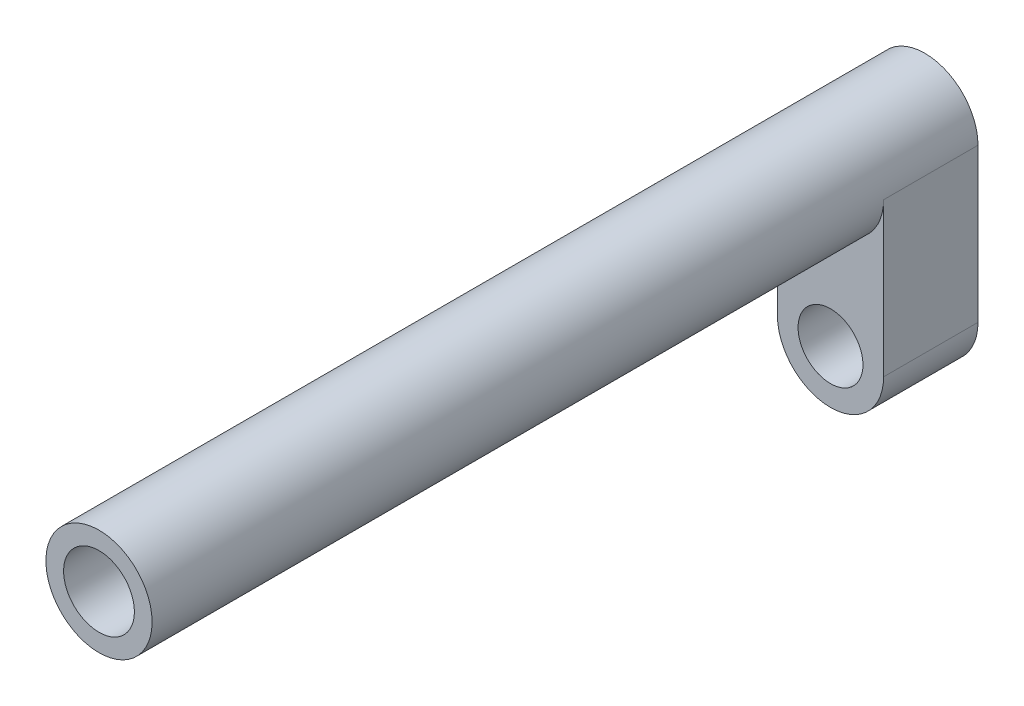
ISO-10303-21;
HEADER;
FILE_DESCRIPTION(('STEP AP214'),'2;1');
FILE_NAME('part.step','',(''),(''),'','','');
FILE_SCHEMA(('AUTOMOTIVE_DESIGN { 1 0 10303 214 1 1 1 1 }'));
ENDSEC;
DATA;
#1=APPLICATION_CONTEXT('core data for automotive mechanical design processes');
#2=APPLICATION_PROTOCOL_DEFINITION('international standard','automotive_design',2000,#1);
#3=PRODUCT_CONTEXT('',#1,'mechanical');
#4=PRODUCT('Part','Part','',(#3));
#5=PRODUCT_RELATED_PRODUCT_CATEGORY('part','',(#4));
#6=PRODUCT_DEFINITION_FORMATION('','',#4);
#7=PRODUCT_DEFINITION_CONTEXT('part definition',#1,'design');
#8=PRODUCT_DEFINITION('design','',#6,#7);
#9=PRODUCT_DEFINITION_SHAPE('','',#8);
#10=(LENGTH_UNIT() NAMED_UNIT(*) SI_UNIT(.MILLI.,.METRE.));
#11=(NAMED_UNIT(*) PLANE_ANGLE_UNIT() SI_UNIT($,.RADIAN.));
#12=(NAMED_UNIT(*) SI_UNIT($,.STERADIAN.) SOLID_ANGLE_UNIT());
#13=UNCERTAINTY_MEASURE_WITH_UNIT(LENGTH_MEASURE(1.E-05),#10,'distance_accuracy_value','');
#14=(GEOMETRIC_REPRESENTATION_CONTEXT(3) GLOBAL_UNCERTAINTY_ASSIGNED_CONTEXT((#13)) GLOBAL_UNIT_ASSIGNED_CONTEXT((#10,
#11,#12)) REPRESENTATION_CONTEXT('',''));
#15=CARTESIAN_POINT('',(0.,0.,0.));
#16=DIRECTION('',(0.,0.,1.));
#17=DIRECTION('',(1.,0.,0.));
#18=AXIS2_PLACEMENT_3D('',#15,#16,#17);
#19=CARTESIAN_POINT('',(2.25,0.,4.));
#20=DIRECTION('',(-1.,0.,0.));
#21=DIRECTION('',(0.,0.,1.));
#22=AXIS2_PLACEMENT_3D('',#19,#20,#21);
#23=PLANE('',#22);
#24=DIRECTION('',(0.,1.,0.));
#25=VECTOR('',#24,1.);
#26=CARTESIAN_POINT('',(2.25,0.,0.));
#27=LINE('',#26,#25);
#28=CARTESIAN_POINT('',(2.25,-2.65129145994813,0.));
#29=VERTEX_POINT('',#28);
#30=CARTESIAN_POINT('',(2.25,3.84870854005187,0.));
#31=VERTEX_POINT('',#30);
#32=EDGE_CURVE('E80',#29,#31,#27,.T.);
#33=ORIENTED_EDGE('',*,*,#32,.T.);
#34=DIRECTION('',(0.,0.,-1.));
#35=VECTOR('',#34,1.);
#36=CARTESIAN_POINT('',(2.25,3.84870854005187,4.));
#37=LINE('',#36,#35);
#38=CARTESIAN_POINT('',(2.25,3.84870854005187,4.));
#39=VERTEX_POINT('',#38);
#40=EDGE_CURVE('E11',#39,#31,#37,.T.);
#41=ORIENTED_EDGE('',*,*,#40,.F.);
#42=DIRECTION('',(0.,1.,0.));
#43=VECTOR('',#42,1.);
#44=CARTESIAN_POINT('',(2.25,0.,4.));
#45=LINE('',#44,#43);
#46=CARTESIAN_POINT('',(2.25,-2.65129145994813,4.));
#47=VERTEX_POINT('',#46);
#48=EDGE_CURVE('E81',#47,#39,#45,.T.);
#49=ORIENTED_EDGE('',*,*,#48,.F.);
#50=DIRECTION('',(0.,0.,-1.));
#51=VECTOR('',#50,1.);
#52=CARTESIAN_POINT('',(2.25,-2.65129145994813,4.));
#53=LINE('',#52,#51);
#54=EDGE_CURVE('E68',#47,#29,#53,.T.);
#55=ORIENTED_EDGE('',*,*,#54,.T.);
#56=EDGE_LOOP('',(#33,#41,#49,#55));
#57=FACE_BOUND('',#56,.T.);
#58=ADVANCED_FACE('F34',(#57),#23,.F.);
#59=CARTESIAN_POINT('',(-2.25,0.,4.));
#60=DIRECTION('',(-1.,0.,0.));
#61=DIRECTION('',(0.,0.,1.));
#62=AXIS2_PLACEMENT_3D('',#59,#60,#61);
#63=PLANE('',#62);
#64=DIRECTION('',(0.,1.,0.));
#65=VECTOR('',#64,1.);
#66=CARTESIAN_POINT('',(-2.25,0.,0.));
#67=LINE('',#66,#65);
#68=CARTESIAN_POINT('',(-2.25,-2.65129145994813,0.));
#69=VERTEX_POINT('',#68);
#70=CARTESIAN_POINT('',(-2.25,3.84870854005187,0.));
#71=VERTEX_POINT('',#70);
#72=EDGE_CURVE('E75',#69,#71,#67,.T.);
#73=ORIENTED_EDGE('',*,*,#72,.F.);
#74=DIRECTION('',(0.,0.,-1.));
#75=VECTOR('',#74,1.);
#76=CARTESIAN_POINT('',(-2.25,-2.65129145994813,4.));
#77=LINE('',#76,#75);
#78=CARTESIAN_POINT('',(-2.25,-2.65129145994813,4.));
#79=VERTEX_POINT('',#78);
#80=EDGE_CURVE('E63',#79,#69,#77,.T.);
#81=ORIENTED_EDGE('',*,*,#80,.F.);
#82=DIRECTION('',(0.,1.,0.));
#83=VECTOR('',#82,1.);
#84=CARTESIAN_POINT('',(-2.25,0.,4.));
#85=LINE('',#84,#83);
#86=CARTESIAN_POINT('',(-2.25,3.84870854005187,4.));
#87=VERTEX_POINT('',#86);
#88=EDGE_CURVE('E105',#79,#87,#85,.T.);
#89=ORIENTED_EDGE('',*,*,#88,.T.);
#90=DIRECTION('',(0.,0.,-1.));
#91=VECTOR('',#90,1.);
#92=CARTESIAN_POINT('',(-2.25,3.84870854005187,4.));
#93=LINE('',#92,#91);
#94=EDGE_CURVE('E42',#87,#71,#93,.T.);
#95=ORIENTED_EDGE('',*,*,#94,.T.);
#96=EDGE_LOOP('',(#73,#81,#89,#95));
#97=FACE_BOUND('',#96,.T.);
#98=ADVANCED_FACE('F104',(#97),#63,.T.);
#99=CARTESIAN_POINT('',(0.,-2.65129145994813,4.));
#100=DIRECTION('',(0.,0.,-1.));
#101=DIRECTION('',(-1.,0.,0.));
#102=AXIS2_PLACEMENT_3D('',#99,#100,#101);
#103=CYLINDRICAL_SURFACE('',#102,2.25);
#104=CARTESIAN_POINT('',(0.,-2.65129145994813,0.));
#105=DIRECTION('',(0.,0.,1.));
#106=DIRECTION('',(1.,0.,0.));
#107=AXIS2_PLACEMENT_3D('',#104,#105,#106);
#108=CIRCLE('',#107,2.25);
#109=EDGE_CURVE('E65',#69,#29,#108,.T.);
#110=ORIENTED_EDGE('',*,*,#109,.T.);
#111=ORIENTED_EDGE('',*,*,#54,.F.);
#112=CARTESIAN_POINT('',(0.,-2.65129145994813,4.));
#113=DIRECTION('',(0.,0.,1.));
#114=DIRECTION('',(1.,0.,0.));
#115=AXIS2_PLACEMENT_3D('',#112,#113,#114);
#116=CIRCLE('',#115,2.25);
#117=EDGE_CURVE('E50',#79,#47,#116,.T.);
#118=ORIENTED_EDGE('',*,*,#117,.F.);
#119=ORIENTED_EDGE('',*,*,#80,.T.);
#120=EDGE_LOOP('',(#110,#111,#118,#119));
#121=FACE_BOUND('',#120,.T.);
#122=ADVANCED_FACE('F67',(#121),#103,.T.);
#123=CARTESIAN_POINT('',(0.,-2.65129145994813,4.));
#124=DIRECTION('',(0.,0.,-1.));
#125=DIRECTION('',(-1.,0.,0.));
#126=AXIS2_PLACEMENT_3D('',#123,#124,#125);
#127=CYLINDRICAL_SURFACE('',#126,1.375);
#128=CARTESIAN_POINT('',(0.,-2.65129145994813,4.));
#129=DIRECTION('',(0.,0.,1.));
#130=DIRECTION('',(1.,0.,0.));
#131=AXIS2_PLACEMENT_3D('',#128,#129,#130);
#132=CIRCLE('',#131,1.375);
#133=CARTESIAN_POINT('',(1.375,-2.65129145994813,4.));
#134=VERTEX_POINT('',#133);
#135=EDGE_CURVE('E82',#134,#134,#132,.T.);
#136=ORIENTED_EDGE('',*,*,#135,.T.);
#137=EDGE_LOOP('',(#136));
#138=FACE_BOUND('',#137,.T.);
#139=CARTESIAN_POINT('',(0.,-2.65129145994813,0.));
#140=DIRECTION('',(0.,0.,1.));
#141=DIRECTION('',(1.,0.,0.));
#142=AXIS2_PLACEMENT_3D('',#139,#140,#141);
#143=CIRCLE('',#142,1.375);
#144=CARTESIAN_POINT('',(1.375,-2.65129145994813,0.));
#145=VERTEX_POINT('',#144);
#146=EDGE_CURVE('E74',#145,#145,#143,.T.);
#147=ORIENTED_EDGE('',*,*,#146,.F.);
#148=EDGE_LOOP('',(#147));
#149=FACE_BOUND('',#148,.T.);
#150=ADVANCED_FACE('F123',(#138,#149),#127,.F.);
#151=CARTESIAN_POINT('',(0.,0.,4.));
#152=DIRECTION('',(0.,0.,1.));
#153=DIRECTION('',(1.,0.,0.));
#154=AXIS2_PLACEMENT_3D('',#151,#152,#153);
#155=PLANE('',#154);
#156=ORIENTED_EDGE('',*,*,#48,.T.);
#157=CARTESIAN_POINT('',(0.,3.84870854005187,4.));
#158=DIRECTION('',(0.,0.,1.));
#159=DIRECTION('',(1.,0.,0.));
#160=AXIS2_PLACEMENT_3D('',#157,#158,#159);
#161=CIRCLE('',#160,2.25);
#162=EDGE_CURVE('E113',#87,#39,#161,.T.);
#163=ORIENTED_EDGE('',*,*,#162,.F.);
#164=ORIENTED_EDGE('',*,*,#88,.F.);
#165=ORIENTED_EDGE('',*,*,#117,.T.);
#166=EDGE_LOOP('',(#156,#163,#164,#165));
#167=FACE_BOUND('',#166,.T.);
#168=ORIENTED_EDGE('',*,*,#135,.F.);
#169=EDGE_LOOP('',(#168));
#170=FACE_BOUND('',#169,.T.);
#171=ADVANCED_FACE('F114',(#167,#170),#155,.T.);
#172=CARTESIAN_POINT('',(0.,0.,0.));
#173=DIRECTION('',(0.,0.,1.));
#174=DIRECTION('',(1.,0.,0.));
#175=AXIS2_PLACEMENT_3D('',#172,#173,#174);
#176=PLANE('',#175);
#177=ORIENTED_EDGE('',*,*,#32,.F.);
#178=ORIENTED_EDGE('',*,*,#109,.F.);
#179=ORIENTED_EDGE('',*,*,#72,.T.);
#180=CARTESIAN_POINT('',(0.,3.84870854005187,0.));
#181=DIRECTION('',(0.,0.,1.));
#182=DIRECTION('',(1.,0.,0.));
#183=AXIS2_PLACEMENT_3D('',#180,#181,#182);
#184=CIRCLE('',#183,2.25);
#185=EDGE_CURVE('E87',#31,#71,#184,.T.);
#186=ORIENTED_EDGE('',*,*,#185,.F.);
#187=EDGE_LOOP('',(#177,#178,#179,#186));
#188=FACE_BOUND('',#187,.T.);
#189=ORIENTED_EDGE('',*,*,#146,.T.);
#190=EDGE_LOOP('',(#189));
#191=FACE_BOUND('',#190,.T.);
#192=CARTESIAN_POINT('',(0.,3.84870854005187,0.));
#193=DIRECTION('',(0.,0.,1.));
#194=DIRECTION('',(1.,0.,0.));
#195=AXIS2_PLACEMENT_3D('',#192,#193,#194);
#196=CIRCLE('',#195,1.5);
#197=CARTESIAN_POINT('',(1.5,3.84870854005187,0.));
#198=VERTEX_POINT('',#197);
#199=EDGE_CURVE('E204',#198,#198,#196,.T.);
#200=ORIENTED_EDGE('',*,*,#199,.T.);
#201=EDGE_LOOP('',(#200));
#202=FACE_BOUND('',#201,.T.);
#203=ADVANCED_FACE('F84',(#188,#191,#202),#176,.F.);
#204=CARTESIAN_POINT('',(0.,3.84870854005187,35.));
#205=DIRECTION('',(0.,0.,-1.));
#206=DIRECTION('',(-1.,0.,0.));
#207=AXIS2_PLACEMENT_3D('',#204,#205,#206);
#208=CYLINDRICAL_SURFACE('',#207,1.5);
#209=CARTESIAN_POINT('',(0.,3.84870854005187,35.));
#210=DIRECTION('',(0.,0.,1.));
#211=DIRECTION('',(1.,0.,0.));
#212=AXIS2_PLACEMENT_3D('',#209,#210,#211);
#213=CIRCLE('',#212,1.5);
#214=CARTESIAN_POINT('',(1.5,3.84870854005187,35.));
#215=VERTEX_POINT('',#214);
#216=EDGE_CURVE('E92',#215,#215,#213,.T.);
#217=ORIENTED_EDGE('',*,*,#216,.T.);
#218=EDGE_LOOP('',(#217));
#219=FACE_BOUND('',#218,.T.);
#220=ORIENTED_EDGE('',*,*,#199,.F.);
#221=EDGE_LOOP('',(#220));
#222=FACE_BOUND('',#221,.T.);
#223=ADVANCED_FACE('F131',(#219,#222),#208,.F.);
#224=CARTESIAN_POINT('',(0.,3.84870854005187,35.));
#225=DIRECTION('',(0.,0.,-1.));
#226=DIRECTION('',(-1.,0.,0.));
#227=AXIS2_PLACEMENT_3D('',#224,#225,#226);
#228=CYLINDRICAL_SURFACE('',#227,2.25);
#229=ORIENTED_EDGE('',*,*,#40,.T.);
#230=ORIENTED_EDGE('',*,*,#185,.T.);
#231=ORIENTED_EDGE('',*,*,#94,.F.);
#232=ORIENTED_EDGE('',*,*,#162,.T.);
#233=EDGE_LOOP('',(#229,#230,#231,#232));
#234=FACE_BOUND('',#233,.T.);
#235=CARTESIAN_POINT('',(0.,3.84870854005187,35.));
#236=DIRECTION('',(0.,0.,1.));
#237=DIRECTION('',(1.,0.,0.));
#238=AXIS2_PLACEMENT_3D('',#235,#236,#237);
#239=CIRCLE('',#238,2.25);
#240=CARTESIAN_POINT('',(2.25,3.84870854005187,35.));
#241=VERTEX_POINT('',#240);
#242=EDGE_CURVE('E88',#241,#241,#239,.T.);
#243=ORIENTED_EDGE('',*,*,#242,.F.);
#244=EDGE_LOOP('',(#243));
#245=FACE_BOUND('',#244,.T.);
#246=ADVANCED_FACE('F111',(#234,#245),#228,.T.);
#247=CARTESIAN_POINT('',(0.,0.,35.));
#248=DIRECTION('',(0.,0.,1.));
#249=DIRECTION('',(1.,0.,0.));
#250=AXIS2_PLACEMENT_3D('',#247,#248,#249);
#251=PLANE('',#250);
#252=ORIENTED_EDGE('',*,*,#216,.F.);
#253=EDGE_LOOP('',(#252));
#254=FACE_BOUND('',#253,.T.);
#255=ORIENTED_EDGE('',*,*,#242,.T.);
#256=EDGE_LOOP('',(#255));
#257=FACE_BOUND('',#256,.T.);
#258=ADVANCED_FACE('F186',(#254,#257),#251,.T.);
#259=CLOSED_SHELL('',(#58,#98,#122,#150,#171,#203,#223,#246,#258));
#260=MANIFOLD_SOLID_BREP('B2',#259);
#261=ADVANCED_BREP_SHAPE_REPRESENTATION('',(#18,#260),#14);
#262=SHAPE_DEFINITION_REPRESENTATION(#9,#261);
ENDSEC;
END-ISO-10303-21;
